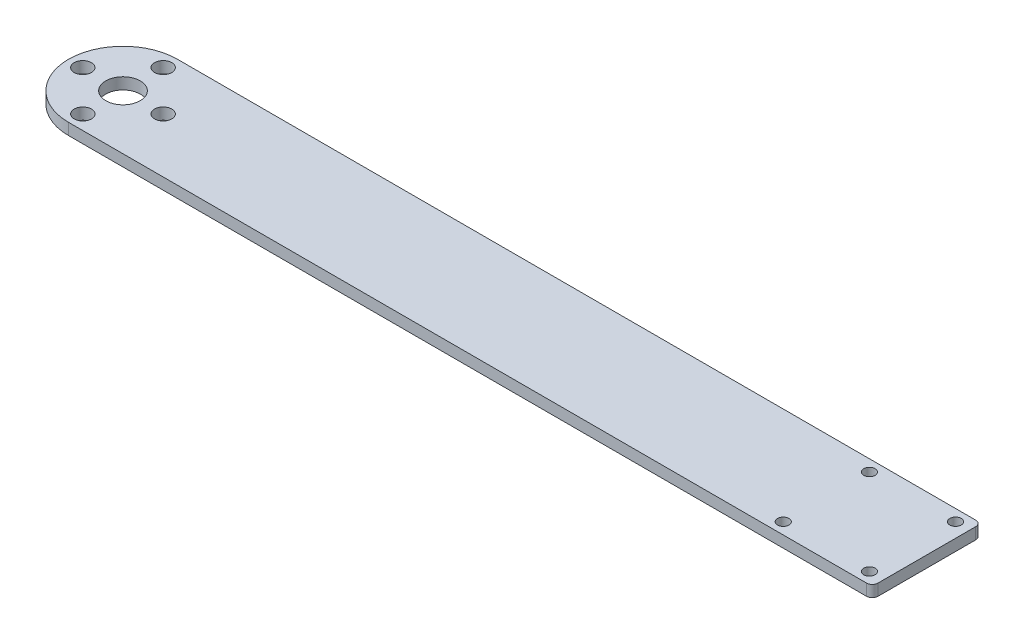
ISO-10303-21;
HEADER;
FILE_DESCRIPTION(('STEP AP214'),'2;1');
FILE_NAME('part.step','',(''),(''),'','','');
FILE_SCHEMA(('AUTOMOTIVE_DESIGN { 1 0 10303 214 1 1 1 1 }'));
ENDSEC;
DATA;
#1=APPLICATION_CONTEXT('core data for automotive mechanical design processes');
#2=APPLICATION_PROTOCOL_DEFINITION('international standard','automotive_design',2000,#1);
#3=PRODUCT_CONTEXT('',#1,'mechanical');
#4=PRODUCT('Part','Part','',(#3));
#5=PRODUCT_RELATED_PRODUCT_CATEGORY('part','',(#4));
#6=PRODUCT_DEFINITION_FORMATION('','',#4);
#7=PRODUCT_DEFINITION_CONTEXT('part definition',#1,'design');
#8=PRODUCT_DEFINITION('design','',#6,#7);
#9=PRODUCT_DEFINITION_SHAPE('','',#8);
#10=(LENGTH_UNIT() NAMED_UNIT(*) SI_UNIT(.MILLI.,.METRE.));
#11=(NAMED_UNIT(*) PLANE_ANGLE_UNIT() SI_UNIT($,.RADIAN.));
#12=(NAMED_UNIT(*) SI_UNIT($,.STERADIAN.) SOLID_ANGLE_UNIT());
#13=UNCERTAINTY_MEASURE_WITH_UNIT(LENGTH_MEASURE(1.E-05),#10,'distance_accuracy_value','');
#14=(GEOMETRIC_REPRESENTATION_CONTEXT(3) GLOBAL_UNCERTAINTY_ASSIGNED_CONTEXT((#13)) GLOBAL_UNIT_ASSIGNED_CONTEXT((#10,
#11,#12)) REPRESENTATION_CONTEXT('',''));
#15=CARTESIAN_POINT('',(0.,0.,0.));
#16=DIRECTION('',(0.,0.,1.));
#17=DIRECTION('',(1.,0.,0.));
#18=AXIS2_PLACEMENT_3D('',#15,#16,#17);
#19=CARTESIAN_POINT('',(0.,2.,0.));
#20=DIRECTION('',(0.,1.,0.));
#21=DIRECTION('',(0.,0.,1.));
#22=AXIS2_PLACEMENT_3D('',#19,#20,#21);
#23=PLANE('',#22);
#24=CARTESIAN_POINT('',(137.5,2.,7.5));
#25=DIRECTION('',(0.,1.,0.));
#26=DIRECTION('',(0.,0.,1.));
#27=AXIS2_PLACEMENT_3D('',#24,#25,#26);
#28=CIRCLE('',#27,0.999999999999998);
#29=CARTESIAN_POINT('',(137.5,2.,8.5));
#30=VERTEX_POINT('',#29);
#31=EDGE_CURVE('E315',#30,#30,#28,.T.);
#32=ORIENTED_EDGE('',*,*,#31,.F.);
#33=EDGE_LOOP('',(#32));
#34=FACE_BOUND('',#33,.T.);
#35=CARTESIAN_POINT('',(137.5,2.,-7.5));
#36=DIRECTION('',(0.,1.,0.));
#37=DIRECTION('',(0.,0.,1.));
#38=AXIS2_PLACEMENT_3D('',#35,#36,#37);
#39=CIRCLE('',#38,0.999999999999998);
#40=CARTESIAN_POINT('',(137.5,2.,-6.5));
#41=VERTEX_POINT('',#40);
#42=EDGE_CURVE('E327',#41,#41,#39,.T.);
#43=ORIENTED_EDGE('',*,*,#42,.F.);
#44=EDGE_LOOP('',(#43));
#45=FACE_BOUND('',#44,.T.);
#46=CARTESIAN_POINT('',(0.,2.,7.));
#47=DIRECTION('',(0.,1.,0.));
#48=DIRECTION('',(0.,0.,1.));
#49=AXIS2_PLACEMENT_3D('',#46,#47,#48);
#50=CIRCLE('',#49,1.5);
#51=CARTESIAN_POINT('',(0.,2.,8.5));
#52=VERTEX_POINT('',#51);
#53=EDGE_CURVE('E339',#52,#52,#50,.T.);
#54=ORIENTED_EDGE('',*,*,#53,.F.);
#55=EDGE_LOOP('',(#54));
#56=FACE_BOUND('',#55,.T.);
#57=CARTESIAN_POINT('',(0.,2.,-7.));
#58=DIRECTION('',(0.,1.,0.));
#59=DIRECTION('',(0.,0.,1.));
#60=AXIS2_PLACEMENT_3D('',#57,#58,#59);
#61=CIRCLE('',#60,1.5);
#62=CARTESIAN_POINT('',(0.,2.,-5.5));
#63=VERTEX_POINT('',#62);
#64=EDGE_CURVE('E351',#63,#63,#61,.T.);
#65=ORIENTED_EDGE('',*,*,#64,.F.);
#66=EDGE_LOOP('',(#65));
#67=FACE_BOUND('',#66,.T.);
#68=DIRECTION('',(1.,0.,0.));
#69=VECTOR('',#68,1.);
#70=CARTESIAN_POINT('',(0.,2.,9.5));
#71=LINE('',#70,#69);
#72=CARTESIAN_POINT('',(0.,2.,9.5));
#73=VERTEX_POINT('',#72);
#74=CARTESIAN_POINT('',(139.,2.,9.5));
#75=VERTEX_POINT('',#74);
#76=EDGE_CURVE('E87',#73,#75,#71,.T.);
#77=ORIENTED_EDGE('',*,*,#76,.T.);
#78=CARTESIAN_POINT('',(139.,2.,8.5));
#79=DIRECTION('',(0.,1.,0.));
#80=DIRECTION('',(0.,0.,1.));
#81=AXIS2_PLACEMENT_3D('',#78,#79,#80);
#82=CIRCLE('',#81,1.);
#83=CARTESIAN_POINT('',(140.,2.,8.5));
#84=VERTEX_POINT('',#83);
#85=EDGE_CURVE('E42',#75,#84,#82,.T.);
#86=ORIENTED_EDGE('',*,*,#85,.T.);
#87=DIRECTION('',(0.,0.,-1.));
#88=VECTOR('',#87,1.);
#89=CARTESIAN_POINT('',(140.,2.,9.5));
#90=LINE('',#89,#88);
#91=CARTESIAN_POINT('',(140.,2.,-8.5));
#92=VERTEX_POINT('',#91);
#93=EDGE_CURVE('E94',#84,#92,#90,.T.);
#94=ORIENTED_EDGE('',*,*,#93,.T.);
#95=CARTESIAN_POINT('',(139.,2.,-8.5));
#96=DIRECTION('',(0.,1.,0.));
#97=DIRECTION('',(0.,0.,1.));
#98=AXIS2_PLACEMENT_3D('',#95,#96,#97);
#99=CIRCLE('',#98,1.);
#100=CARTESIAN_POINT('',(139.,2.,-9.5));
#101=VERTEX_POINT('',#100);
#102=EDGE_CURVE('E49',#92,#101,#99,.T.);
#103=ORIENTED_EDGE('',*,*,#102,.T.);
#104=DIRECTION('',(-1.,0.,0.));
#105=VECTOR('',#104,1.);
#106=CARTESIAN_POINT('',(0.,2.,-9.5));
#107=LINE('',#106,#105);
#108=CARTESIAN_POINT('',(0.,2.,-9.5));
#109=VERTEX_POINT('',#108);
#110=EDGE_CURVE('E99',#101,#109,#107,.T.);
#111=ORIENTED_EDGE('',*,*,#110,.T.);
#112=CARTESIAN_POINT('',(0.,2.,0.));
#113=DIRECTION('',(0.,1.,0.));
#114=DIRECTION('',(0.,0.,1.));
#115=AXIS2_PLACEMENT_3D('',#112,#113,#114);
#116=CIRCLE('',#115,9.5);
#117=EDGE_CURVE('E95',#109,#73,#116,.T.);
#118=ORIENTED_EDGE('',*,*,#117,.T.);
#119=EDGE_LOOP('',(#77,#86,#94,#103,#111,#118));
#120=FACE_BOUND('',#119,.T.);
#121=CARTESIAN_POINT('',(122.5,2.,-7.5));
#122=DIRECTION('',(0.,1.,0.));
#123=DIRECTION('',(0.,0.,1.));
#124=AXIS2_PLACEMENT_3D('',#121,#122,#123);
#125=CIRCLE('',#124,1.00000000000001);
#126=CARTESIAN_POINT('',(122.5,2.,-6.49999999999998));
#127=VERTEX_POINT('',#126);
#128=EDGE_CURVE('E140',#127,#127,#125,.T.);
#129=ORIENTED_EDGE('',*,*,#128,.F.);
#130=EDGE_LOOP('',(#129));
#131=FACE_BOUND('',#130,.T.);
#132=CARTESIAN_POINT('',(7.,2.,0.));
#133=DIRECTION('',(0.,1.,0.));
#134=DIRECTION('',(0.,0.,1.));
#135=AXIS2_PLACEMENT_3D('',#132,#133,#134);
#136=CIRCLE('',#135,1.5);
#137=CARTESIAN_POINT('',(7.,2.,1.5));
#138=VERTEX_POINT('',#137);
#139=EDGE_CURVE('E345',#138,#138,#136,.T.);
#140=ORIENTED_EDGE('',*,*,#139,.F.);
#141=EDGE_LOOP('',(#140));
#142=FACE_BOUND('',#141,.T.);
#143=CARTESIAN_POINT('',(-7.,2.,0.));
#144=DIRECTION('',(0.,1.,0.));
#145=DIRECTION('',(0.,0.,1.));
#146=AXIS2_PLACEMENT_3D('',#143,#144,#145);
#147=CIRCLE('',#146,1.5);
#148=CARTESIAN_POINT('',(-7.,2.,1.5));
#149=VERTEX_POINT('',#148);
#150=EDGE_CURVE('E333',#149,#149,#147,.T.);
#151=ORIENTED_EDGE('',*,*,#150,.F.);
#152=EDGE_LOOP('',(#151));
#153=FACE_BOUND('',#152,.T.);
#154=CARTESIAN_POINT('',(122.5,2.,7.5));
#155=DIRECTION('',(0.,1.,0.));
#156=DIRECTION('',(0.,0.,1.));
#157=AXIS2_PLACEMENT_3D('',#154,#155,#156);
#158=CIRCLE('',#157,0.999999999999998);
#159=CARTESIAN_POINT('',(122.5,2.,8.5));
#160=VERTEX_POINT('',#159);
#161=EDGE_CURVE('E321',#160,#160,#158,.T.);
#162=ORIENTED_EDGE('',*,*,#161,.F.);
#163=EDGE_LOOP('',(#162));
#164=FACE_BOUND('',#163,.T.);
#165=CARTESIAN_POINT('',(0.,2.,0.));
#166=DIRECTION('',(0.,1.,0.));
#167=DIRECTION('',(0.,0.,1.));
#168=AXIS2_PLACEMENT_3D('',#165,#166,#167);
#169=CIRCLE('',#168,3.);
#170=CARTESIAN_POINT('',(0.,2.,3.));
#171=VERTEX_POINT('',#170);
#172=EDGE_CURVE('E306',#171,#171,#169,.T.);
#173=ORIENTED_EDGE('',*,*,#172,.F.);
#174=EDGE_LOOP('',(#173));
#175=FACE_BOUND('',#174,.T.);
#176=ADVANCED_FACE('F34',(#34,#45,#56,#67,#120,#131,#142,#153,#164,#175),#23,.T.);
#177=CARTESIAN_POINT('',(0.,0.,0.));
#178=DIRECTION('',(0.,1.,0.));
#179=DIRECTION('',(0.,0.,1.));
#180=AXIS2_PLACEMENT_3D('',#177,#178,#179);
#181=PLANE('',#180);
#182=DIRECTION('',(0.,0.,-1.));
#183=VECTOR('',#182,1.);
#184=CARTESIAN_POINT('',(140.,0.,9.5));
#185=LINE('',#184,#183);
#186=CARTESIAN_POINT('',(140.,0.,8.5));
#187=VERTEX_POINT('',#186);
#188=CARTESIAN_POINT('',(140.,0.,-8.5));
#189=VERTEX_POINT('',#188);
#190=EDGE_CURVE('E137',#187,#189,#185,.T.);
#191=ORIENTED_EDGE('',*,*,#190,.F.);
#192=CARTESIAN_POINT('',(139.,0.,8.5));
#193=DIRECTION('',(0.,1.,0.));
#194=DIRECTION('',(0.,0.,1.));
#195=AXIS2_PLACEMENT_3D('',#192,#193,#194);
#196=CIRCLE('',#195,1.);
#197=CARTESIAN_POINT('',(139.,0.,9.5));
#198=VERTEX_POINT('',#197);
#199=EDGE_CURVE('E120',#187,#198,#196,.F.);
#200=ORIENTED_EDGE('',*,*,#199,.T.);
#201=DIRECTION('',(1.,0.,0.));
#202=VECTOR('',#201,1.);
#203=CARTESIAN_POINT('',(0.,0.,9.5));
#204=LINE('',#203,#202);
#205=CARTESIAN_POINT('',(0.,0.,9.5));
#206=VERTEX_POINT('',#205);
#207=EDGE_CURVE('E136',#206,#198,#204,.T.);
#208=ORIENTED_EDGE('',*,*,#207,.F.);
#209=CARTESIAN_POINT('',(0.,0.,0.));
#210=DIRECTION('',(0.,1.,0.));
#211=DIRECTION('',(0.,0.,1.));
#212=AXIS2_PLACEMENT_3D('',#209,#210,#211);
#213=CIRCLE('',#212,9.5);
#214=CARTESIAN_POINT('',(0.,0.,-9.5));
#215=VERTEX_POINT('',#214);
#216=EDGE_CURVE('E107',#215,#206,#213,.T.);
#217=ORIENTED_EDGE('',*,*,#216,.F.);
#218=DIRECTION('',(-1.,0.,0.));
#219=VECTOR('',#218,1.);
#220=CARTESIAN_POINT('',(0.,0.,-9.5));
#221=LINE('',#220,#219);
#222=CARTESIAN_POINT('',(139.,0.,-9.5));
#223=VERTEX_POINT('',#222);
#224=EDGE_CURVE('E103',#223,#215,#221,.T.);
#225=ORIENTED_EDGE('',*,*,#224,.F.);
#226=CARTESIAN_POINT('',(139.,0.,-8.5));
#227=DIRECTION('',(0.,1.,0.));
#228=DIRECTION('',(0.,0.,1.));
#229=AXIS2_PLACEMENT_3D('',#226,#227,#228);
#230=CIRCLE('',#229,1.);
#231=EDGE_CURVE('E118',#223,#189,#230,.F.);
#232=ORIENTED_EDGE('',*,*,#231,.T.);
#233=EDGE_LOOP('',(#191,#200,#208,#217,#225,#232));
#234=FACE_BOUND('',#233,.T.);
#235=CARTESIAN_POINT('',(122.5,0.,-7.5));
#236=DIRECTION('',(0.,1.,0.));
#237=DIRECTION('',(0.,0.,1.));
#238=AXIS2_PLACEMENT_3D('',#235,#236,#237);
#239=CIRCLE('',#238,1.00000000000001);
#240=CARTESIAN_POINT('',(122.5,0.,-6.49999999999998));
#241=VERTEX_POINT('',#240);
#242=EDGE_CURVE('E354',#241,#241,#239,.T.);
#243=ORIENTED_EDGE('',*,*,#242,.T.);
#244=EDGE_LOOP('',(#243));
#245=FACE_BOUND('',#244,.T.);
#246=CARTESIAN_POINT('',(0.,0.,-7.));
#247=DIRECTION('',(0.,1.,0.));
#248=DIRECTION('',(0.,0.,1.));
#249=AXIS2_PLACEMENT_3D('',#246,#247,#248);
#250=CIRCLE('',#249,1.5);
#251=CARTESIAN_POINT('',(0.,0.,-5.5));
#252=VERTEX_POINT('',#251);
#253=EDGE_CURVE('E348',#252,#252,#250,.T.);
#254=ORIENTED_EDGE('',*,*,#253,.T.);
#255=EDGE_LOOP('',(#254));
#256=FACE_BOUND('',#255,.T.);
#257=CARTESIAN_POINT('',(7.,0.,0.));
#258=DIRECTION('',(0.,1.,0.));
#259=DIRECTION('',(0.,0.,1.));
#260=AXIS2_PLACEMENT_3D('',#257,#258,#259);
#261=CIRCLE('',#260,1.5);
#262=CARTESIAN_POINT('',(7.,0.,1.5));
#263=VERTEX_POINT('',#262);
#264=EDGE_CURVE('E342',#263,#263,#261,.T.);
#265=ORIENTED_EDGE('',*,*,#264,.T.);
#266=EDGE_LOOP('',(#265));
#267=FACE_BOUND('',#266,.T.);
#268=CARTESIAN_POINT('',(0.,0.,7.));
#269=DIRECTION('',(0.,1.,0.));
#270=DIRECTION('',(0.,0.,1.));
#271=AXIS2_PLACEMENT_3D('',#268,#269,#270);
#272=CIRCLE('',#271,1.5);
#273=CARTESIAN_POINT('',(0.,0.,8.5));
#274=VERTEX_POINT('',#273);
#275=EDGE_CURVE('E336',#274,#274,#272,.T.);
#276=ORIENTED_EDGE('',*,*,#275,.T.);
#277=EDGE_LOOP('',(#276));
#278=FACE_BOUND('',#277,.T.);
#279=CARTESIAN_POINT('',(-7.,0.,0.));
#280=DIRECTION('',(0.,1.,0.));
#281=DIRECTION('',(0.,0.,1.));
#282=AXIS2_PLACEMENT_3D('',#279,#280,#281);
#283=CIRCLE('',#282,1.5);
#284=CARTESIAN_POINT('',(-7.,0.,1.5));
#285=VERTEX_POINT('',#284);
#286=EDGE_CURVE('E330',#285,#285,#283,.T.);
#287=ORIENTED_EDGE('',*,*,#286,.T.);
#288=EDGE_LOOP('',(#287));
#289=FACE_BOUND('',#288,.T.);
#290=CARTESIAN_POINT('',(137.5,0.,-7.5));
#291=DIRECTION('',(0.,1.,0.));
#292=DIRECTION('',(0.,0.,1.));
#293=AXIS2_PLACEMENT_3D('',#290,#291,#292);
#294=CIRCLE('',#293,0.999999999999998);
#295=CARTESIAN_POINT('',(137.5,0.,-6.5));
#296=VERTEX_POINT('',#295);
#297=EDGE_CURVE('E324',#296,#296,#294,.T.);
#298=ORIENTED_EDGE('',*,*,#297,.T.);
#299=EDGE_LOOP('',(#298));
#300=FACE_BOUND('',#299,.T.);
#301=CARTESIAN_POINT('',(122.5,0.,7.5));
#302=DIRECTION('',(0.,1.,0.));
#303=DIRECTION('',(0.,0.,1.));
#304=AXIS2_PLACEMENT_3D('',#301,#302,#303);
#305=CIRCLE('',#304,0.999999999999998);
#306=CARTESIAN_POINT('',(122.5,0.,8.5));
#307=VERTEX_POINT('',#306);
#308=EDGE_CURVE('E318',#307,#307,#305,.T.);
#309=ORIENTED_EDGE('',*,*,#308,.T.);
#310=EDGE_LOOP('',(#309));
#311=FACE_BOUND('',#310,.T.);
#312=CARTESIAN_POINT('',(137.5,0.,7.5));
#313=DIRECTION('',(0.,1.,0.));
#314=DIRECTION('',(0.,0.,1.));
#315=AXIS2_PLACEMENT_3D('',#312,#313,#314);
#316=CIRCLE('',#315,0.999999999999998);
#317=CARTESIAN_POINT('',(137.5,0.,8.5));
#318=VERTEX_POINT('',#317);
#319=EDGE_CURVE('E312',#318,#318,#316,.T.);
#320=ORIENTED_EDGE('',*,*,#319,.T.);
#321=EDGE_LOOP('',(#320));
#322=FACE_BOUND('',#321,.T.);
#323=CARTESIAN_POINT('',(0.,0.,0.));
#324=DIRECTION('',(0.,1.,0.));
#325=DIRECTION('',(0.,0.,1.));
#326=AXIS2_PLACEMENT_3D('',#323,#324,#325);
#327=CIRCLE('',#326,3.);
#328=CARTESIAN_POINT('',(0.,0.,3.));
#329=VERTEX_POINT('',#328);
#330=EDGE_CURVE('E309',#329,#329,#327,.T.);
#331=ORIENTED_EDGE('',*,*,#330,.T.);
#332=EDGE_LOOP('',(#331));
#333=FACE_BOUND('',#332,.T.);
#334=ADVANCED_FACE('F134',(#234,#245,#256,#267,#278,#289,#300,#311,#322,#333),#181,.F.);
#335=CARTESIAN_POINT('',(0.,2.,0.));
#336=DIRECTION('',(0.,-1.,0.));
#337=DIRECTION('',(0.,0.,-1.));
#338=AXIS2_PLACEMENT_3D('',#335,#336,#337);
#339=CYLINDRICAL_SURFACE('',#338,9.5);
#340=ORIENTED_EDGE('',*,*,#216,.T.);
#341=DIRECTION('',(0.,-1.,0.));
#342=VECTOR('',#341,1.);
#343=CARTESIAN_POINT('',(0.,2.,9.5));
#344=LINE('',#343,#342);
#345=EDGE_CURVE('E91',#73,#206,#344,.T.);
#346=ORIENTED_EDGE('',*,*,#345,.F.);
#347=ORIENTED_EDGE('',*,*,#117,.F.);
#348=DIRECTION('',(0.,-1.,0.));
#349=VECTOR('',#348,1.);
#350=CARTESIAN_POINT('',(0.,2.,-9.5));
#351=LINE('',#350,#349);
#352=EDGE_CURVE('E109',#109,#215,#351,.T.);
#353=ORIENTED_EDGE('',*,*,#352,.T.);
#354=EDGE_LOOP('',(#340,#346,#347,#353));
#355=FACE_BOUND('',#354,.T.);
#356=ADVANCED_FACE('F105',(#355),#339,.T.);
#357=CARTESIAN_POINT('',(0.,2.,9.5));
#358=DIRECTION('',(0.,0.,-1.));
#359=DIRECTION('',(-1.,0.,0.));
#360=AXIS2_PLACEMENT_3D('',#357,#358,#359);
#361=PLANE('',#360);
#362=ORIENTED_EDGE('',*,*,#207,.T.);
#363=DIRECTION('',(0.,-1.,0.));
#364=VECTOR('',#363,1.);
#365=CARTESIAN_POINT('',(139.,2.,9.5));
#366=LINE('',#365,#364);
#367=EDGE_CURVE('E57',#198,#75,#366,.F.);
#368=ORIENTED_EDGE('',*,*,#367,.T.);
#369=ORIENTED_EDGE('',*,*,#76,.F.);
#370=ORIENTED_EDGE('',*,*,#345,.T.);
#371=EDGE_LOOP('',(#362,#368,#369,#370));
#372=FACE_BOUND('',#371,.T.);
#373=ADVANCED_FACE('F89',(#372),#361,.F.);
#374=CARTESIAN_POINT('',(140.,2.,9.5));
#375=DIRECTION('',(-1.,0.,0.));
#376=DIRECTION('',(0.,0.,1.));
#377=AXIS2_PLACEMENT_3D('',#374,#375,#376);
#378=PLANE('',#377);
#379=ORIENTED_EDGE('',*,*,#93,.F.);
#380=DIRECTION('',(0.,-1.,0.));
#381=VECTOR('',#380,1.);
#382=CARTESIAN_POINT('',(140.,2.,8.5));
#383=LINE('',#382,#381);
#384=EDGE_CURVE('E111',#84,#187,#383,.T.);
#385=ORIENTED_EDGE('',*,*,#384,.T.);
#386=ORIENTED_EDGE('',*,*,#190,.T.);
#387=DIRECTION('',(0.,-1.,0.));
#388=VECTOR('',#387,1.);
#389=CARTESIAN_POINT('',(140.,2.,-8.5));
#390=LINE('',#389,#388);
#391=EDGE_CURVE('E108',#189,#92,#390,.F.);
#392=ORIENTED_EDGE('',*,*,#391,.T.);
#393=EDGE_LOOP('',(#379,#385,#386,#392));
#394=FACE_BOUND('',#393,.T.);
#395=ADVANCED_FACE('F127',(#394),#378,.F.);
#396=CARTESIAN_POINT('',(0.,2.,-9.5));
#397=DIRECTION('',(0.,0.,1.));
#398=DIRECTION('',(1.,0.,0.));
#399=AXIS2_PLACEMENT_3D('',#396,#397,#398);
#400=PLANE('',#399);
#401=ORIENTED_EDGE('',*,*,#110,.F.);
#402=DIRECTION('',(0.,-1.,0.));
#403=VECTOR('',#402,1.);
#404=CARTESIAN_POINT('',(139.,2.,-9.5));
#405=LINE('',#404,#403);
#406=EDGE_CURVE('E11',#101,#223,#405,.T.);
#407=ORIENTED_EDGE('',*,*,#406,.T.);
#408=ORIENTED_EDGE('',*,*,#224,.T.);
#409=ORIENTED_EDGE('',*,*,#352,.F.);
#410=EDGE_LOOP('',(#401,#407,#408,#409));
#411=FACE_BOUND('',#410,.T.);
#412=ADVANCED_FACE('F145',(#411),#400,.F.);
#413=CARTESIAN_POINT('',(122.5,2.,-7.5));
#414=DIRECTION('',(0.,-1.,0.));
#415=DIRECTION('',(0.,0.,-1.));
#416=AXIS2_PLACEMENT_3D('',#413,#414,#415);
#417=CYLINDRICAL_SURFACE('',#416,1.00000000000001);
#418=ORIENTED_EDGE('',*,*,#128,.T.);
#419=EDGE_LOOP('',(#418));
#420=FACE_BOUND('',#419,.T.);
#421=ORIENTED_EDGE('',*,*,#242,.F.);
#422=EDGE_LOOP('',(#421));
#423=FACE_BOUND('',#422,.T.);
#424=ADVANCED_FACE('F163',(#420,#423),#417,.F.);
#425=CARTESIAN_POINT('',(0.,2.,-7.));
#426=DIRECTION('',(0.,-1.,0.));
#427=DIRECTION('',(0.,0.,-1.));
#428=AXIS2_PLACEMENT_3D('',#425,#426,#427);
#429=CYLINDRICAL_SURFACE('',#428,1.5);
#430=ORIENTED_EDGE('',*,*,#64,.T.);
#431=EDGE_LOOP('',(#430));
#432=FACE_BOUND('',#431,.T.);
#433=ORIENTED_EDGE('',*,*,#253,.F.);
#434=EDGE_LOOP('',(#433));
#435=FACE_BOUND('',#434,.T.);
#436=ADVANCED_FACE('F196',(#432,#435),#429,.F.);
#437=CARTESIAN_POINT('',(7.,2.,0.));
#438=DIRECTION('',(0.,-1.,0.));
#439=DIRECTION('',(0.,0.,-1.));
#440=AXIS2_PLACEMENT_3D('',#437,#438,#439);
#441=CYLINDRICAL_SURFACE('',#440,1.5);
#442=ORIENTED_EDGE('',*,*,#139,.T.);
#443=EDGE_LOOP('',(#442));
#444=FACE_BOUND('',#443,.T.);
#445=ORIENTED_EDGE('',*,*,#264,.F.);
#446=EDGE_LOOP('',(#445));
#447=FACE_BOUND('',#446,.T.);
#448=ADVANCED_FACE('F203',(#444,#447),#441,.F.);
#449=CARTESIAN_POINT('',(0.,2.,7.));
#450=DIRECTION('',(0.,-1.,0.));
#451=DIRECTION('',(0.,0.,-1.));
#452=AXIS2_PLACEMENT_3D('',#449,#450,#451);
#453=CYLINDRICAL_SURFACE('',#452,1.5);
#454=ORIENTED_EDGE('',*,*,#53,.T.);
#455=EDGE_LOOP('',(#454));
#456=FACE_BOUND('',#455,.T.);
#457=ORIENTED_EDGE('',*,*,#275,.F.);
#458=EDGE_LOOP('',(#457));
#459=FACE_BOUND('',#458,.T.);
#460=ADVANCED_FACE('F210',(#456,#459),#453,.F.);
#461=CARTESIAN_POINT('',(-7.,2.,0.));
#462=DIRECTION('',(0.,-1.,0.));
#463=DIRECTION('',(0.,0.,-1.));
#464=AXIS2_PLACEMENT_3D('',#461,#462,#463);
#465=CYLINDRICAL_SURFACE('',#464,1.5);
#466=ORIENTED_EDGE('',*,*,#150,.T.);
#467=EDGE_LOOP('',(#466));
#468=FACE_BOUND('',#467,.T.);
#469=ORIENTED_EDGE('',*,*,#286,.F.);
#470=EDGE_LOOP('',(#469));
#471=FACE_BOUND('',#470,.T.);
#472=ADVANCED_FACE('F218',(#468,#471),#465,.F.);
#473=CARTESIAN_POINT('',(137.5,2.,-7.5));
#474=DIRECTION('',(0.,-1.,0.));
#475=DIRECTION('',(0.,0.,-1.));
#476=AXIS2_PLACEMENT_3D('',#473,#474,#475);
#477=CYLINDRICAL_SURFACE('',#476,0.999999999999998);
#478=ORIENTED_EDGE('',*,*,#42,.T.);
#479=EDGE_LOOP('',(#478));
#480=FACE_BOUND('',#479,.T.);
#481=ORIENTED_EDGE('',*,*,#297,.F.);
#482=EDGE_LOOP('',(#481));
#483=FACE_BOUND('',#482,.T.);
#484=ADVANCED_FACE('F226',(#480,#483),#477,.F.);
#485=CARTESIAN_POINT('',(122.5,2.,7.5));
#486=DIRECTION('',(0.,-1.,0.));
#487=DIRECTION('',(0.,0.,-1.));
#488=AXIS2_PLACEMENT_3D('',#485,#486,#487);
#489=CYLINDRICAL_SURFACE('',#488,0.999999999999998);
#490=ORIENTED_EDGE('',*,*,#161,.T.);
#491=EDGE_LOOP('',(#490));
#492=FACE_BOUND('',#491,.T.);
#493=ORIENTED_EDGE('',*,*,#308,.F.);
#494=EDGE_LOOP('',(#493));
#495=FACE_BOUND('',#494,.T.);
#496=ADVANCED_FACE('F234',(#492,#495),#489,.F.);
#497=CARTESIAN_POINT('',(137.5,2.,7.5));
#498=DIRECTION('',(0.,-1.,0.));
#499=DIRECTION('',(0.,0.,-1.));
#500=AXIS2_PLACEMENT_3D('',#497,#498,#499);
#501=CYLINDRICAL_SURFACE('',#500,0.999999999999998);
#502=ORIENTED_EDGE('',*,*,#31,.T.);
#503=EDGE_LOOP('',(#502));
#504=FACE_BOUND('',#503,.T.);
#505=ORIENTED_EDGE('',*,*,#319,.F.);
#506=EDGE_LOOP('',(#505));
#507=FACE_BOUND('',#506,.T.);
#508=ADVANCED_FACE('F242',(#504,#507),#501,.F.);
#509=CARTESIAN_POINT('',(0.,2.,0.));
#510=DIRECTION('',(0.,-1.,0.));
#511=DIRECTION('',(0.,0.,-1.));
#512=AXIS2_PLACEMENT_3D('',#509,#510,#511);
#513=CYLINDRICAL_SURFACE('',#512,3.);
#514=ORIENTED_EDGE('',*,*,#172,.T.);
#515=EDGE_LOOP('',(#514));
#516=FACE_BOUND('',#515,.T.);
#517=ORIENTED_EDGE('',*,*,#330,.F.);
#518=EDGE_LOOP('',(#517));
#519=FACE_BOUND('',#518,.T.);
#520=ADVANCED_FACE('F152',(#516,#519),#513,.F.);
#521=CARTESIAN_POINT('',(139.,2.,8.5));
#522=DIRECTION('',(0.,-1.,0.));
#523=DIRECTION('',(0.,0.,-1.));
#524=AXIS2_PLACEMENT_3D('',#521,#522,#523);
#525=CYLINDRICAL_SURFACE('',#524,1.);
#526=ORIENTED_EDGE('',*,*,#85,.F.);
#527=ORIENTED_EDGE('',*,*,#367,.F.);
#528=ORIENTED_EDGE('',*,*,#199,.F.);
#529=ORIENTED_EDGE('',*,*,#384,.F.);
#530=EDGE_LOOP('',(#526,#527,#528,#529));
#531=FACE_BOUND('',#530,.T.);
#532=ADVANCED_FACE('F132',(#531),#525,.T.);
#533=CARTESIAN_POINT('',(139.,2.,-8.5));
#534=DIRECTION('',(0.,-1.,0.));
#535=DIRECTION('',(0.,0.,-1.));
#536=AXIS2_PLACEMENT_3D('',#533,#534,#535);
#537=CYLINDRICAL_SURFACE('',#536,1.);
#538=ORIENTED_EDGE('',*,*,#102,.F.);
#539=ORIENTED_EDGE('',*,*,#391,.F.);
#540=ORIENTED_EDGE('',*,*,#231,.F.);
#541=ORIENTED_EDGE('',*,*,#406,.F.);
#542=EDGE_LOOP('',(#538,#539,#540,#541));
#543=FACE_BOUND('',#542,.T.);
#544=ADVANCED_FACE('F36',(#543),#537,.T.);
#545=CLOSED_SHELL('',(#176,#334,#356,#373,#395,#412,#424,#436,#448,#460,#472,#484,#496,#508,
#520,#532,#544));
#546=MANIFOLD_SOLID_BREP('B2',#545);
#547=ADVANCED_BREP_SHAPE_REPRESENTATION('',(#18,#546),#14);
#548=SHAPE_DEFINITION_REPRESENTATION(#9,#547);
ENDSEC;
END-ISO-10303-21;
